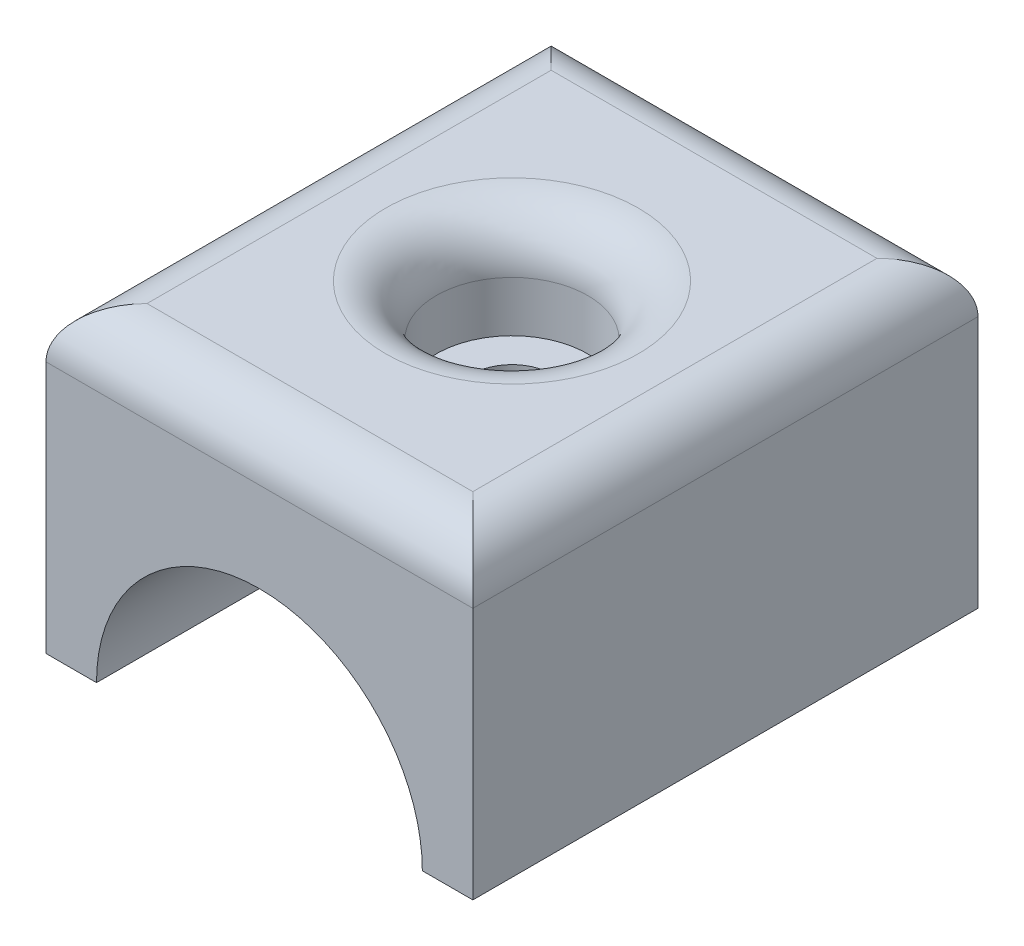
ISO-10303-21;
HEADER;
FILE_DESCRIPTION(('STEP AP214'),'2;1');
FILE_NAME('part.step','',(''),(''),'','','');
FILE_SCHEMA(('AUTOMOTIVE_DESIGN { 1 0 10303 214 1 1 1 1 }'));
ENDSEC;
DATA;
#1=APPLICATION_CONTEXT('core data for automotive mechanical design processes');
#2=APPLICATION_PROTOCOL_DEFINITION('international standard','automotive_design',2000,#1);
#3=PRODUCT_CONTEXT('',#1,'mechanical');
#4=PRODUCT('Part','Part','',(#3));
#5=PRODUCT_RELATED_PRODUCT_CATEGORY('part','',(#4));
#6=PRODUCT_DEFINITION_FORMATION('','',#4);
#7=PRODUCT_DEFINITION_CONTEXT('part definition',#1,'design');
#8=PRODUCT_DEFINITION('design','',#6,#7);
#9=PRODUCT_DEFINITION_SHAPE('','',#8);
#10=(LENGTH_UNIT() NAMED_UNIT(*) SI_UNIT(.MILLI.,.METRE.));
#11=(NAMED_UNIT(*) PLANE_ANGLE_UNIT() SI_UNIT($,.RADIAN.));
#12=(NAMED_UNIT(*) SI_UNIT($,.STERADIAN.) SOLID_ANGLE_UNIT());
#13=UNCERTAINTY_MEASURE_WITH_UNIT(LENGTH_MEASURE(1.E-05),#10,'distance_accuracy_value','');
#14=(GEOMETRIC_REPRESENTATION_CONTEXT(3) GLOBAL_UNCERTAINTY_ASSIGNED_CONTEXT((#13)) GLOBAL_UNIT_ASSIGNED_CONTEXT((#10,
#11,#12)) REPRESENTATION_CONTEXT('',''));
#15=CARTESIAN_POINT('',(0.,0.,0.));
#16=DIRECTION('',(0.,0.,1.));
#17=DIRECTION('',(1.,0.,0.));
#18=AXIS2_PLACEMENT_3D('',#15,#16,#17);
#19=CARTESIAN_POINT('',(6.45,-8.,-10.));
#20=DIRECTION('',(0.,1.,0.));
#21=DIRECTION('',(0.,0.,1.));
#22=AXIS2_PLACEMENT_3D('',#19,#20,#21);
#23=CYLINDRICAL_SURFACE('',#22,1.6);
#24=CARTESIAN_POINT('',(6.45,6.45,-8.4));
#25=CARTESIAN_POINT('',(6.36157662343515,6.44999849049042,-8.40000252115168));
#26=CARTESIAN_POINT('',(6.27312494505996,6.44816355947124,-8.40735469051378));
#27=CARTESIAN_POINT('',(6.09875514169487,6.44102141765576,-8.43652595713284));
#28=CARTESIAN_POINT('',(6.01283850695931,6.43571220535279,-8.45835339357685));
#29=CARTESIAN_POINT('',(5.84608215142292,6.42220962535897,-8.51573289056304));
#30=CARTESIAN_POINT('',(5.7652365178872,6.41401969309484,-8.55126860804102));
#31=CARTESIAN_POINT('',(5.6106542639552,6.39562866632555,-8.63499880137553));
#32=CARTESIAN_POINT('',(5.53691785651226,6.38542751160308,-8.68319365626931));
#33=CARTESIAN_POINT('',(5.39715005336474,6.36389062225283,-8.79190762140806));
#34=CARTESIAN_POINT('',(5.33128354359891,6.35253760039097,-8.85263530326442));
#35=CARTESIAN_POINT('',(5.21055810354297,6.3300918267767,-8.98424445432793));
#36=CARTESIAN_POINT('',(5.15570039759881,6.31899910409452,-9.05512705141487));
#37=CARTESIAN_POINT('',(5.05777746104887,6.2981558667738,-9.20631020182157));
#38=CARTESIAN_POINT('',(5.01489609277723,6.28842731273894,-9.2867331472688));
#39=CARTESIAN_POINT('',(4.94332526758095,6.27166577790828,-9.45392637597255));
#40=CARTESIAN_POINT('',(4.91463358020357,6.26463237350548,-9.54069565919568));
#41=CARTESIAN_POINT('',(4.8728179217432,6.25423506122415,-9.71630696666267));
#42=CARTESIAN_POINT('',(4.85939777091085,6.25080144566162,-9.8050742435355));
#43=CARTESIAN_POINT('',(4.84758368240241,6.24778377828733,-9.98366155846488));
#44=CARTESIAN_POINT('',(4.84918734022522,6.2481991104666,-10.0734814257604));
#45=CARTESIAN_POINT('',(4.86713890519613,6.25276972130836,-10.2493588471403));
#46=CARTESIAN_POINT('',(4.88313447374384,6.2568356228072,-10.3354550487018));
#47=CARTESIAN_POINT('',(4.92885399982749,6.26810688515046,-10.5037021552097));
#48=CARTESIAN_POINT('',(4.95857892190845,6.27531246656863,-10.5858527825151));
#49=CARTESIAN_POINT('',(5.03121513930547,6.29213362972878,-10.7448245516961));
#50=CARTESIAN_POINT('',(5.07425480164272,6.30177249658023,-10.8215844737596));
#51=CARTESIAN_POINT('',(5.17220895491527,6.32236095506883,-10.9669192040935));
#52=CARTESIAN_POINT('',(5.22712549421131,6.33331077265516,-11.0354925972936));
#53=CARTESIAN_POINT('',(5.34910222580684,6.35566416052664,-11.1645274804094));
#54=CARTESIAN_POINT('',(5.41645990217126,6.36707184211341,-11.2247073944916));
#55=CARTESIAN_POINT('',(5.56044755251951,6.38877838682705,-11.3329702752276));
#56=CARTESIAN_POINT('',(5.63707780108998,6.39907721710067,-11.3810528835164));
#57=CARTESIAN_POINT('',(5.79783327960682,6.41745563989433,-11.4638574025138));
#58=CARTESIAN_POINT('',(5.88198268478151,6.42552770630375,-11.4985341582797));
#59=CARTESIAN_POINT('',(6.05516111384198,6.43848830506943,-11.5531715838994));
#60=CARTESIAN_POINT('',(6.14418921576127,6.44337743669647,-11.5731350240137));
#61=CARTESIAN_POINT('',(6.32218992201107,6.44933283243893,-11.5973504531162));
#62=CARTESIAN_POINT('',(6.4111073061001,6.45049239447559,-11.601985966329));
#63=CARTESIAN_POINT('',(6.58844722066892,6.44912344850614,-11.5964650488406));
#64=CARTESIAN_POINT('',(6.67686979426529,6.44659526702723,-11.58630992776));
#65=CARTESIAN_POINT('',(6.84938143219895,6.43819463426067,-11.5518122808157));
#66=CARTESIAN_POINT('',(6.93351484496567,6.43237140674695,-11.5276784562468));
#67=CARTESIAN_POINT('',(7.09653499682589,6.41803665515849,-11.466146414299));
#68=CARTESIAN_POINT('',(7.17542120989598,6.40952486204955,-11.4287468694257));
#69=CARTESIAN_POINT('',(7.32723754002416,6.39053322030122,-11.3409981131996));
#70=CARTESIAN_POINT('',(7.40003901519069,6.38002148929719,-11.2904334008195));
#71=CARTESIAN_POINT('',(7.53625970322394,6.35824713455991,-11.1780656431827));
#72=CARTESIAN_POINT('',(7.59967731992895,6.34698438355231,-11.1162606899763));
#73=CARTESIAN_POINT('',(7.71690645084881,6.32464239672223,-10.9813873583698));
#74=CARTESIAN_POINT('',(7.77044913447954,6.31357415324934,-10.9080831079855));
#75=CARTESIAN_POINT('',(7.86447236316739,6.29317818055017,-10.7533031811855));
#76=CARTESIAN_POINT('',(7.90495348985702,6.28385037382985,-10.6718278688401));
#77=CARTESIAN_POINT('',(7.97140415954157,6.26809350313888,-10.5034573996768));
#78=CARTESIAN_POINT('',(7.99745968954135,6.26164730803951,-10.4165978660754));
#79=CARTESIAN_POINT('',(8.03454823806501,6.25236589209876,-10.2395471964512));
#80=CARTESIAN_POINT('',(8.04558448153507,6.24952989608271,-10.1493567799099));
#81=CARTESIAN_POINT('',(8.05215464425875,6.24784841306234,-9.97093838362816));
#82=CARTESIAN_POINT('',(8.04811798732276,6.2488923826287,-9.8827270039045));
#83=CARTESIAN_POINT('',(8.02563824724506,6.25459798568508,-9.70828477675027));
#84=CARTESIAN_POINT('',(8.00719544501384,6.25925954863438,-9.62205389073512));
#85=CARTESIAN_POINT('',(7.95665978849409,6.27161397295002,-9.45447908846979));
#86=CARTESIAN_POINT('',(7.92464629933688,6.27928919068253,-9.37310984799888));
#87=CARTESIAN_POINT('',(7.84794102740262,6.29680885504907,-9.21683978021788));
#88=CARTESIAN_POINT('',(7.80324751322538,6.30665359788096,-9.14193983808441));
#89=CARTESIAN_POINT('',(7.70109950781582,6.32771927768767,-8.99865660996335));
#90=CARTESIAN_POINT('',(7.64334651037868,6.3389690862118,-8.93049034078189));
#91=CARTESIAN_POINT('',(7.51730220203402,6.36140364042187,-8.80467690608048));
#92=CARTESIAN_POINT('',(7.44900839798525,6.37258837006403,-8.74703223621721));
#93=CARTESIAN_POINT('',(7.30235766252648,6.39386944615715,-8.64290144188131));
#94=CARTESIAN_POINT('',(7.22384359155783,6.40394294294271,-8.59663160526584));
#95=CARTESIAN_POINT('',(7.05990923810509,6.42162636778055,-8.51802125419647));
#96=CARTESIAN_POINT('',(6.97449401468882,6.42923808039122,-8.48567064398763));
#97=CARTESIAN_POINT('',(6.81601194399226,6.43999946458731,-8.44068342041275));
#98=CARTESIAN_POINT('',(6.7437074693463,6.44372407630527,-8.42545984994759));
#99=CARTESIAN_POINT('',(6.59760849796877,6.44872488489781,-8.40511745544044));
#100=CARTESIAN_POINT('',(6.52381411016261,6.45000126010916,-8.39999789539175));
#101=CARTESIAN_POINT('',(6.45,6.45,-8.4));
#102=B_SPLINE_CURVE_WITH_KNOTS('',3,(#24,#25,#26,#27,#28,#29,#30,#31,#32,#33,#34,#35,#36,#37,
#38,#39,#40,#41,#42,#43,#44,#45,#46,#47,#48,#49,#50,#51,#52,#53,#54,#55,#56,#57,#58,#59,#60,#61,
#62,#63,#64,#65,#66,#67,#68,#69,#70,#71,#72,#73,#74,#75,#76,#77,#78,#79,#80,#81,#82,#83,#84,#85,
#86,#87,#88,#89,#90,#91,#92,#93,#94,#95,#96,#97,#98,#99,#100,#101),.UNSPECIFIED.,.T.,.F.,(4,2,2,
2,2,2,2,2,2,2,2,2,2,2,2,2,2,2,2,2,2,2,2,2,2,2,2,2,2,2,2,2,2,2,2,2,2,2,4),(0.,0.264999649148441,
0.530152097109118,0.794989401444675,1.05983463638799,1.32950592410481,1.59920718675796,
1.87284606218524,2.14644191108309,2.41463596861989,2.68278710349287,2.94454688559176,
3.2063250602179,3.47071011943624,3.73514081257462,4.00699062691579,4.27884849345676,
4.55161424252066,4.82432862142932,5.09016553055583,5.35597890287343,5.61792240211927,
5.87989212133041,6.14645386107196,6.41306089004564,6.68610346151255,6.95913387268635,
7.23051880441443,7.50184545508124,7.76550182548306,8.02915305488513,8.29128320085795,
8.55344915675998,8.82235449937956,9.09132354199036,9.36506804800366,9.63861366829116,
9.85984632274575,10.0810628613491),.UNSPECIFIED.);
#103=CARTESIAN_POINT('',(6.45,6.45,-8.4));
#104=VERTEX_POINT('',#103);
#105=EDGE_CURVE('E132',#104,#104,#102,.T.);
#106=ORIENTED_EDGE('',*,*,#105,.T.);
#107=EDGE_LOOP('',(#106));
#108=FACE_BOUND('',#107,.T.);
#109=CARTESIAN_POINT('',(6.45,8.,-10.));
#110=DIRECTION('',(0.,1.,0.));
#111=DIRECTION('',(0.,0.,1.));
#112=AXIS2_PLACEMENT_3D('',#109,#110,#111);
#113=CIRCLE('',#112,1.6);
#114=CARTESIAN_POINT('',(6.45,8.,-8.4));
#115=VERTEX_POINT('',#114);
#116=EDGE_CURVE('E156',#115,#115,#113,.F.);
#117=ORIENTED_EDGE('',*,*,#116,.F.);
#118=EDGE_LOOP('',(#117));
#119=FACE_BOUND('',#118,.T.);
#120=ADVANCED_FACE('F34',(#108,#119),#23,.F.);
#121=CARTESIAN_POINT('',(6.45,0.,-20.));
#122=DIRECTION('',(0.,0.,1.));
#123=DIRECTION('',(1.,0.,0.));
#124=AXIS2_PLACEMENT_3D('',#121,#122,#123);
#125=CYLINDRICAL_SURFACE('',#124,6.45);
#126=ORIENTED_EDGE('',*,*,#105,.F.);
#127=EDGE_LOOP('',(#126));
#128=FACE_BOUND('',#127,.T.);
#129=CARTESIAN_POINT('',(6.45,0.,0.));
#130=DIRECTION('',(0.,0.,-1.));
#131=DIRECTION('',(-1.,0.,0.));
#132=AXIS2_PLACEMENT_3D('',#129,#130,#131);
#133=CIRCLE('',#132,6.45);
#134=CARTESIAN_POINT('',(0.,0.,0.));
#135=VERTEX_POINT('',#134);
#136=CARTESIAN_POINT('',(12.9,0.,0.));
#137=VERTEX_POINT('',#136);
#138=EDGE_CURVE('E144',#135,#137,#133,.T.);
#139=ORIENTED_EDGE('',*,*,#138,.F.);
#140=DIRECTION('',(0.,0.,1.));
#141=VECTOR('',#140,1.);
#142=CARTESIAN_POINT('',(0.,0.,-20.));
#143=LINE('',#142,#141);
#144=CARTESIAN_POINT('',(0.,0.,-20.));
#145=VERTEX_POINT('',#144);
#146=EDGE_CURVE('E125',#145,#135,#143,.T.);
#147=ORIENTED_EDGE('',*,*,#146,.F.);
#148=CARTESIAN_POINT('',(6.45,0.,-20.));
#149=DIRECTION('',(0.,0.,-1.));
#150=DIRECTION('',(-1.,0.,0.));
#151=AXIS2_PLACEMENT_3D('',#148,#149,#150);
#152=CIRCLE('',#151,6.45);
#153=CARTESIAN_POINT('',(12.9,0.,-20.));
#154=VERTEX_POINT('',#153);
#155=EDGE_CURVE('E120',#145,#154,#152,.T.);
#156=ORIENTED_EDGE('',*,*,#155,.T.);
#157=DIRECTION('',(0.,0.,1.));
#158=VECTOR('',#157,1.);
#159=CARTESIAN_POINT('',(12.9,0.,-20.));
#160=LINE('',#159,#158);
#161=EDGE_CURVE('E104',#154,#137,#160,.T.);
#162=ORIENTED_EDGE('',*,*,#161,.T.);
#163=EDGE_LOOP('',(#139,#147,#156,#162));
#164=FACE_BOUND('',#163,.T.);
#165=ADVANCED_FACE('F124',(#128,#164),#125,.F.);
#166=CARTESIAN_POINT('',(0.,0.,-20.));
#167=DIRECTION('',(0.,-1.,0.));
#168=DIRECTION('',(1.,0.,0.));
#169=AXIS2_PLACEMENT_3D('',#166,#167,#168);
#170=PLANE('',#169);
#171=DIRECTION('',(1.,0.,0.));
#172=VECTOR('',#171,1.);
#173=CARTESIAN_POINT('',(0.,0.,0.));
#174=LINE('',#173,#172);
#175=CARTESIAN_POINT('',(-2.,0.,0.));
#176=VERTEX_POINT('',#175);
#177=EDGE_CURVE('E126',#176,#135,#174,.T.);
#178=ORIENTED_EDGE('',*,*,#177,.F.);
#179=DIRECTION('',(0.,0.,1.));
#180=VECTOR('',#179,1.);
#181=CARTESIAN_POINT('',(-2.,0.,-20.));
#182=LINE('',#181,#180);
#183=CARTESIAN_POINT('',(-2.,0.,-20.));
#184=VERTEX_POINT('',#183);
#185=EDGE_CURVE('E152',#184,#176,#182,.T.);
#186=ORIENTED_EDGE('',*,*,#185,.F.);
#187=DIRECTION('',(1.,0.,0.));
#188=VECTOR('',#187,1.);
#189=CARTESIAN_POINT('',(0.,0.,-20.));
#190=LINE('',#189,#188);
#191=EDGE_CURVE('E115',#184,#145,#190,.T.);
#192=ORIENTED_EDGE('',*,*,#191,.T.);
#193=ORIENTED_EDGE('',*,*,#146,.T.);
#194=EDGE_LOOP('',(#178,#186,#192,#193));
#195=FACE_BOUND('',#194,.T.);
#196=ADVANCED_FACE('F214',(#195),#170,.T.);
#197=CARTESIAN_POINT('',(-2.,0.,-20.));
#198=DIRECTION('',(-1.,0.,0.));
#199=DIRECTION('',(0.,0.,1.));
#200=AXIS2_PLACEMENT_3D('',#197,#198,#199);
#201=PLANE('',#200);
#202=DIRECTION('',(0.,-1.,0.));
#203=VECTOR('',#202,1.);
#204=CARTESIAN_POINT('',(-2.,0.,0.));
#205=LINE('',#204,#203);
#206=CARTESIAN_POINT('',(-2.,10.,0.));
#207=VERTEX_POINT('',#206);
#208=EDGE_CURVE('E129',#207,#176,#205,.T.);
#209=ORIENTED_EDGE('',*,*,#208,.F.);
#210=DIRECTION('',(0.,0.,1.));
#211=VECTOR('',#210,1.);
#212=CARTESIAN_POINT('',(-2.,10.,-20.));
#213=LINE('',#212,#211);
#214=CARTESIAN_POINT('',(-2.,10.,-20.));
#215=VERTEX_POINT('',#214);
#216=EDGE_CURVE('E171',#207,#215,#213,.F.);
#217=ORIENTED_EDGE('',*,*,#216,.T.);
#218=DIRECTION('',(0.,-1.,0.));
#219=VECTOR('',#218,1.);
#220=CARTESIAN_POINT('',(-2.,0.,-20.));
#221=LINE('',#220,#219);
#222=EDGE_CURVE('E141',#215,#184,#221,.T.);
#223=ORIENTED_EDGE('',*,*,#222,.T.);
#224=ORIENTED_EDGE('',*,*,#185,.T.);
#225=EDGE_LOOP('',(#209,#217,#223,#224));
#226=FACE_BOUND('',#225,.T.);
#227=ADVANCED_FACE('F227',(#226),#201,.T.);
#228=CARTESIAN_POINT('',(-2.,12.,-20.));
#229=DIRECTION('',(0.,1.,0.));
#230=DIRECTION('',(0.,0.,1.));
#231=AXIS2_PLACEMENT_3D('',#228,#229,#230);
#232=PLANE('',#231);
#233=DIRECTION('',(-1.,0.,0.));
#234=VECTOR('',#233,1.);
#235=CARTESIAN_POINT('',(-2.,12.,-18.));
#236=LINE('',#235,#234);
#237=CARTESIAN_POINT('',(12.9,12.,-18.));
#238=VERTEX_POINT('',#237);
#239=CARTESIAN_POINT('',(0.,12.,-18.));
#240=VERTEX_POINT('',#239);
#241=EDGE_CURVE('E166',#238,#240,#236,.T.);
#242=ORIENTED_EDGE('',*,*,#241,.T.);
#243=DIRECTION('',(0.,0.,1.));
#244=VECTOR('',#243,1.);
#245=CARTESIAN_POINT('',(0.,12.,-20.));
#246=LINE('',#245,#244);
#247=CARTESIAN_POINT('',(0.,12.,-2.));
#248=VERTEX_POINT('',#247);
#249=EDGE_CURVE('E168',#240,#248,#246,.T.);
#250=ORIENTED_EDGE('',*,*,#249,.T.);
#251=DIRECTION('',(-1.,0.,0.));
#252=VECTOR('',#251,1.);
#253=CARTESIAN_POINT('',(14.9,12.,-2.));
#254=LINE('',#253,#252);
#255=CARTESIAN_POINT('',(12.9,12.,-2.));
#256=VERTEX_POINT('',#255);
#257=EDGE_CURVE('E162',#248,#256,#254,.F.);
#258=ORIENTED_EDGE('',*,*,#257,.T.);
#259=DIRECTION('',(0.,0.,1.));
#260=VECTOR('',#259,1.);
#261=CARTESIAN_POINT('',(12.9,12.,-20.));
#262=LINE('',#261,#260);
#263=EDGE_CURVE('E164',#256,#238,#262,.F.);
#264=ORIENTED_EDGE('',*,*,#263,.T.);
#265=EDGE_LOOP('',(#242,#250,#258,#264));
#266=FACE_BOUND('',#265,.T.);
#267=CARTESIAN_POINT('',(6.45,12.,-10.));
#268=DIRECTION('',(0.,1.,0.));
#269=DIRECTION('',(0.,0.,1.));
#270=AXIS2_PLACEMENT_3D('',#267,#268,#269);
#271=CIRCLE('',#270,5.);
#272=CARTESIAN_POINT('',(6.45,12.,-5.));
#273=VERTEX_POINT('',#272);
#274=EDGE_CURVE('E151',#273,#273,#271,.F.);
#275=ORIENTED_EDGE('',*,*,#274,.T.);
#276=EDGE_LOOP('',(#275));
#277=FACE_BOUND('',#276,.T.);
#278=ADVANCED_FACE('F231',(#266,#277),#232,.T.);
#279=CARTESIAN_POINT('',(14.9,12.,-20.));
#280=DIRECTION('',(1.,0.,0.));
#281=DIRECTION('',(0.,1.,0.));
#282=AXIS2_PLACEMENT_3D('',#279,#280,#281);
#283=PLANE('',#282);
#284=DIRECTION('',(0.,1.,0.));
#285=VECTOR('',#284,1.);
#286=CARTESIAN_POINT('',(14.9,12.,-20.));
#287=LINE('',#286,#285);
#288=CARTESIAN_POINT('',(14.9,0.,-20.));
#289=VERTEX_POINT('',#288);
#290=CARTESIAN_POINT('',(14.9,10.,-20.));
#291=VERTEX_POINT('',#290);
#292=EDGE_CURVE('E122',#289,#291,#287,.T.);
#293=ORIENTED_EDGE('',*,*,#292,.T.);
#294=DIRECTION('',(0.,0.,1.));
#295=VECTOR('',#294,1.);
#296=CARTESIAN_POINT('',(14.9,10.,-20.));
#297=LINE('',#296,#295);
#298=CARTESIAN_POINT('',(14.9,10.,0.));
#299=VERTEX_POINT('',#298);
#300=EDGE_CURVE('E51',#291,#299,#297,.T.);
#301=ORIENTED_EDGE('',*,*,#300,.T.);
#302=DIRECTION('',(0.,1.,0.));
#303=VECTOR('',#302,1.);
#304=CARTESIAN_POINT('',(14.9,12.,0.));
#305=LINE('',#304,#303);
#306=CARTESIAN_POINT('',(14.9,0.,0.));
#307=VERTEX_POINT('',#306);
#308=EDGE_CURVE('E147',#307,#299,#305,.T.);
#309=ORIENTED_EDGE('',*,*,#308,.F.);
#310=DIRECTION('',(0.,0.,1.));
#311=VECTOR('',#310,1.);
#312=CARTESIAN_POINT('',(14.9,0.,-20.));
#313=LINE('',#312,#311);
#314=EDGE_CURVE('E114',#289,#307,#313,.T.);
#315=ORIENTED_EDGE('',*,*,#314,.F.);
#316=EDGE_LOOP('',(#293,#301,#309,#315));
#317=FACE_BOUND('',#316,.T.);
#318=ADVANCED_FACE('F235',(#317),#283,.T.);
#319=CARTESIAN_POINT('',(14.9,0.,-20.));
#320=DIRECTION('',(0.,-1.,0.));
#321=DIRECTION('',(1.,0.,0.));
#322=AXIS2_PLACEMENT_3D('',#319,#320,#321);
#323=PLANE('',#322);
#324=DIRECTION('',(1.,0.,0.));
#325=VECTOR('',#324,1.);
#326=CARTESIAN_POINT('',(14.9,0.,0.));
#327=LINE('',#326,#325);
#328=EDGE_CURVE('E109',#137,#307,#327,.T.);
#329=ORIENTED_EDGE('',*,*,#328,.F.);
#330=ORIENTED_EDGE('',*,*,#161,.F.);
#331=DIRECTION('',(1.,0.,0.));
#332=VECTOR('',#331,1.);
#333=CARTESIAN_POINT('',(14.9,0.,-20.));
#334=LINE('',#333,#332);
#335=EDGE_CURVE('E107',#154,#289,#334,.T.);
#336=ORIENTED_EDGE('',*,*,#335,.T.);
#337=ORIENTED_EDGE('',*,*,#314,.T.);
#338=EDGE_LOOP('',(#329,#330,#336,#337));
#339=FACE_BOUND('',#338,.T.);
#340=ADVANCED_FACE('F106',(#339),#323,.T.);
#341=CARTESIAN_POINT('',(6.45,0.,-20.));
#342=DIRECTION('',(0.,0.,-1.));
#343=DIRECTION('',(-1.,0.,0.));
#344=AXIS2_PLACEMENT_3D('',#341,#342,#343);
#345=PLANE('',#344);
#346=ORIENTED_EDGE('',*,*,#222,.F.);
#347=DIRECTION('',(-1.,0.,0.));
#348=VECTOR('',#347,1.);
#349=CARTESIAN_POINT('',(6.45,10.,-20.));
#350=LINE('',#349,#348);
#351=EDGE_CURVE('E59',#215,#291,#350,.F.);
#352=ORIENTED_EDGE('',*,*,#351,.T.);
#353=ORIENTED_EDGE('',*,*,#292,.F.);
#354=ORIENTED_EDGE('',*,*,#335,.F.);
#355=ORIENTED_EDGE('',*,*,#155,.F.);
#356=ORIENTED_EDGE('',*,*,#191,.F.);
#357=EDGE_LOOP('',(#346,#352,#353,#354,#355,#356));
#358=FACE_BOUND('',#357,.T.);
#359=ADVANCED_FACE('F118',(#358),#345,.T.);
#360=CARTESIAN_POINT('',(6.45,0.,0.));
#361=DIRECTION('',(0.,0.,-1.));
#362=DIRECTION('',(-1.,0.,0.));
#363=AXIS2_PLACEMENT_3D('',#360,#361,#362);
#364=PLANE('',#363);
#365=ORIENTED_EDGE('',*,*,#308,.T.);
#366=DIRECTION('',(-1.,0.,0.));
#367=VECTOR('',#366,1.);
#368=CARTESIAN_POINT('',(-2.,10.,0.));
#369=LINE('',#368,#367);
#370=EDGE_CURVE('E43',#299,#207,#369,.T.);
#371=ORIENTED_EDGE('',*,*,#370,.T.);
#372=ORIENTED_EDGE('',*,*,#208,.T.);
#373=ORIENTED_EDGE('',*,*,#177,.T.);
#374=ORIENTED_EDGE('',*,*,#138,.T.);
#375=ORIENTED_EDGE('',*,*,#328,.T.);
#376=EDGE_LOOP('',(#365,#371,#372,#373,#374,#375));
#377=FACE_BOUND('',#376,.T.);
#378=ADVANCED_FACE('F207',(#377),#364,.F.);
#379=CARTESIAN_POINT('',(6.45,8.,-10.));
#380=DIRECTION('',(0.,1.,0.));
#381=DIRECTION('',(0.,0.,1.));
#382=AXIS2_PLACEMENT_3D('',#379,#380,#381);
#383=PLANE('',#382);
#384=CARTESIAN_POINT('',(6.45,8.,-10.));
#385=DIRECTION('',(0.,1.,0.));
#386=DIRECTION('',(0.,0.,1.));
#387=AXIS2_PLACEMENT_3D('',#384,#385,#386);
#388=CIRCLE('',#387,3.);
#389=CARTESIAN_POINT('',(6.45,8.,-7.));
#390=VERTEX_POINT('',#389);
#391=EDGE_CURVE('E159',#390,#390,#388,.T.);
#392=ORIENTED_EDGE('',*,*,#391,.T.);
#393=EDGE_LOOP('',(#392));
#394=FACE_BOUND('',#393,.T.);
#395=ORIENTED_EDGE('',*,*,#116,.T.);
#396=EDGE_LOOP('',(#395));
#397=FACE_BOUND('',#396,.T.);
#398=ADVANCED_FACE('F193',(#394,#397),#383,.T.);
#399=CARTESIAN_POINT('',(6.45,8.,-10.));
#400=DIRECTION('',(0.,1.,0.));
#401=DIRECTION('',(0.,0.,1.));
#402=AXIS2_PLACEMENT_3D('',#399,#400,#401);
#403=CYLINDRICAL_SURFACE('',#402,3.);
#404=CARTESIAN_POINT('',(6.45,10.,-10.));
#405=DIRECTION('',(0.,1.,0.));
#406=DIRECTION('',(0.,0.,1.));
#407=AXIS2_PLACEMENT_3D('',#404,#405,#406);
#408=CIRCLE('',#407,3.);
#409=CARTESIAN_POINT('',(6.45,10.,-7.));
#410=VERTEX_POINT('',#409);
#411=EDGE_CURVE('E11',#410,#410,#408,.T.);
#412=ORIENTED_EDGE('',*,*,#411,.T.);
#413=EDGE_LOOP('',(#412));
#414=FACE_BOUND('',#413,.T.);
#415=ORIENTED_EDGE('',*,*,#391,.F.);
#416=EDGE_LOOP('',(#415));
#417=FACE_BOUND('',#416,.T.);
#418=ADVANCED_FACE('F196',(#414,#417),#403,.F.);
#419=CARTESIAN_POINT('',(12.9,10.,-20.));
#420=DIRECTION('',(0.,0.,1.));
#421=DIRECTION('',(1.,0.,0.));
#422=AXIS2_PLACEMENT_3D('',#419,#420,#421);
#423=CYLINDRICAL_SURFACE('',#422,2.);
#424=CARTESIAN_POINT('',(12.9,10.,-2.));
#425=DIRECTION('',(0.707106781186547,0.,-0.707106781186547));
#426=DIRECTION('',(0.707106781186547,0.,0.707106781186547));
#427=AXIS2_PLACEMENT_3D('',#424,#425,#426);
#428=ELLIPSE('',#427,2.82842712474619,2.);
#429=EDGE_CURVE('E180',#299,#256,#428,.F.);
#430=ORIENTED_EDGE('',*,*,#429,.F.);
#431=ORIENTED_EDGE('',*,*,#300,.F.);
#432=CARTESIAN_POINT('',(12.9,10.,-18.));
#433=DIRECTION('',(0.707106781186547,0.,0.707106781186547));
#434=DIRECTION('',(-0.707106781186547,0.,0.707106781186547));
#435=AXIS2_PLACEMENT_3D('',#432,#433,#434);
#436=ELLIPSE('',#435,2.82842712474619,2.);
#437=EDGE_CURVE('E38',#238,#291,#436,.F.);
#438=ORIENTED_EDGE('',*,*,#437,.F.);
#439=ORIENTED_EDGE('',*,*,#263,.F.);
#440=EDGE_LOOP('',(#430,#431,#438,#439));
#441=FACE_BOUND('',#440,.T.);
#442=ADVANCED_FACE('F198',(#441),#423,.T.);
#443=CARTESIAN_POINT('',(-2.,10.,-18.));
#444=DIRECTION('',(-1.,0.,0.));
#445=DIRECTION('',(0.,0.,1.));
#446=AXIS2_PLACEMENT_3D('',#443,#444,#445);
#447=CYLINDRICAL_SURFACE('',#446,2.);
#448=ORIENTED_EDGE('',*,*,#437,.T.);
#449=ORIENTED_EDGE('',*,*,#351,.F.);
#450=CARTESIAN_POINT('',(0.,10.,-18.));
#451=DIRECTION('',(-0.707106781186547,0.,0.707106781186547));
#452=DIRECTION('',(-0.707106781186547,0.,-0.707106781186547));
#453=AXIS2_PLACEMENT_3D('',#450,#451,#452);
#454=ELLIPSE('',#453,2.82842712474619,2.);
#455=EDGE_CURVE('E179',#240,#215,#454,.T.);
#456=ORIENTED_EDGE('',*,*,#455,.F.);
#457=ORIENTED_EDGE('',*,*,#241,.F.);
#458=EDGE_LOOP('',(#448,#449,#456,#457));
#459=FACE_BOUND('',#458,.T.);
#460=ADVANCED_FACE('F205',(#459),#447,.T.);
#461=CARTESIAN_POINT('',(6.45,10.,-2.));
#462=DIRECTION('',(1.,0.,0.));
#463=DIRECTION('',(0.,0.,-1.));
#464=AXIS2_PLACEMENT_3D('',#461,#462,#463);
#465=CYLINDRICAL_SURFACE('',#464,2.);
#466=ORIENTED_EDGE('',*,*,#429,.T.);
#467=ORIENTED_EDGE('',*,*,#257,.F.);
#468=CARTESIAN_POINT('',(0.,10.,-2.));
#469=DIRECTION('',(0.707106781186547,0.,0.707106781186547));
#470=DIRECTION('',(0.707106781186547,0.,-0.707106781186547));
#471=AXIS2_PLACEMENT_3D('',#468,#469,#470);
#472=ELLIPSE('',#471,2.82842712474619,2.);
#473=EDGE_CURVE('E177',#207,#248,#472,.F.);
#474=ORIENTED_EDGE('',*,*,#473,.F.);
#475=ORIENTED_EDGE('',*,*,#370,.F.);
#476=EDGE_LOOP('',(#466,#467,#474,#475));
#477=FACE_BOUND('',#476,.T.);
#478=ADVANCED_FACE('F245',(#477),#465,.T.);
#479=CARTESIAN_POINT('',(0.,10.,-20.));
#480=DIRECTION('',(0.,0.,1.));
#481=DIRECTION('',(1.,0.,0.));
#482=AXIS2_PLACEMENT_3D('',#479,#480,#481);
#483=CYLINDRICAL_SURFACE('',#482,2.);
#484=ORIENTED_EDGE('',*,*,#455,.T.);
#485=ORIENTED_EDGE('',*,*,#216,.F.);
#486=ORIENTED_EDGE('',*,*,#473,.T.);
#487=ORIENTED_EDGE('',*,*,#249,.F.);
#488=EDGE_LOOP('',(#484,#485,#486,#487));
#489=FACE_BOUND('',#488,.T.);
#490=ADVANCED_FACE('F242',(#489),#483,.T.);
#491=CARTESIAN_POINT('',(6.45,10.,-10.));
#492=DIRECTION('',(0.,1.,0.));
#493=DIRECTION('',(0.,0.,1.));
#494=AXIS2_PLACEMENT_3D('',#491,#492,#493);
#495=TOROIDAL_SURFACE('',#494,5.,2.);
#496=ORIENTED_EDGE('',*,*,#274,.F.);
#497=EDGE_LOOP('',(#496));
#498=FACE_BOUND('',#497,.T.);
#499=ORIENTED_EDGE('',*,*,#411,.F.);
#500=EDGE_LOOP('',(#499));
#501=FACE_BOUND('',#500,.T.);
#502=ADVANCED_FACE('F36',(#498,#501),#495,.T.);
#503=CLOSED_SHELL('',(#120,#165,#196,#227,#278,#318,#340,#359,#378,#398,#418,#442,#460,#478,
#490,#502));
#504=MANIFOLD_SOLID_BREP('B2',#503);
#505=ADVANCED_BREP_SHAPE_REPRESENTATION('',(#18,#504),#14);
#506=SHAPE_DEFINITION_REPRESENTATION(#9,#505);
ENDSEC;
END-ISO-10303-21;
